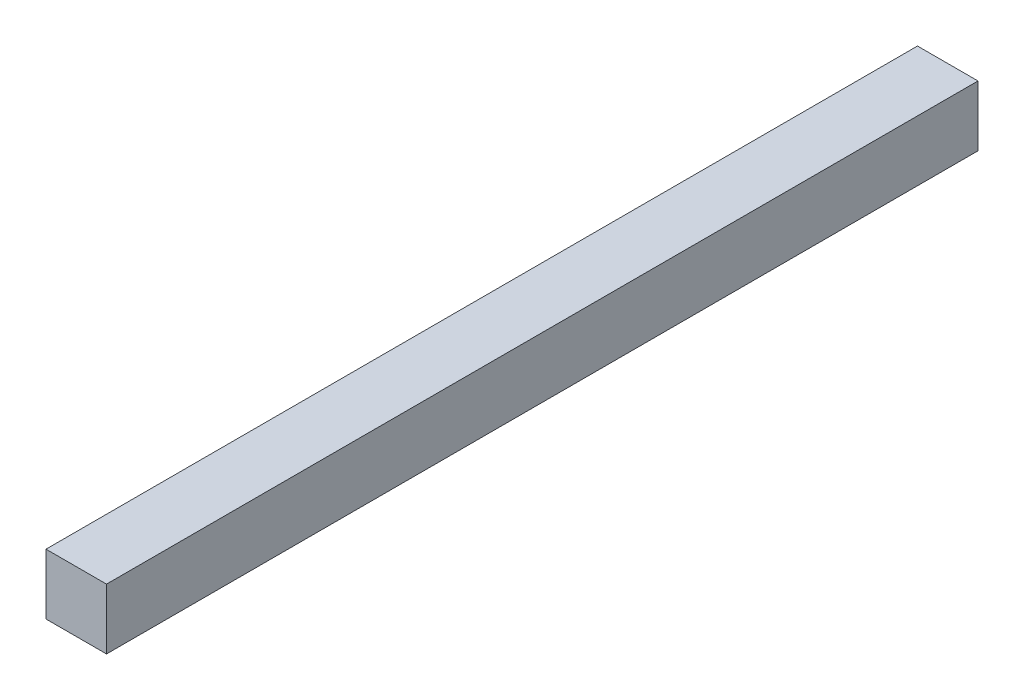
ISO-10303-21;
HEADER;
FILE_DESCRIPTION(('STEP AP214'),'2;1');
FILE_NAME('part.step','',(''),(''),'','','');
FILE_SCHEMA(('AUTOMOTIVE_DESIGN { 1 0 10303 214 1 1 1 1 }'));
ENDSEC;
DATA;
#1=APPLICATION_CONTEXT('core data for automotive mechanical design processes');
#2=APPLICATION_PROTOCOL_DEFINITION('international standard','automotive_design',2000,#1);
#3=PRODUCT_CONTEXT('',#1,'mechanical');
#4=PRODUCT('Part','Part','',(#3));
#5=PRODUCT_RELATED_PRODUCT_CATEGORY('part','',(#4));
#6=PRODUCT_DEFINITION_FORMATION('','',#4);
#7=PRODUCT_DEFINITION_CONTEXT('part definition',#1,'design');
#8=PRODUCT_DEFINITION('design','',#6,#7);
#9=PRODUCT_DEFINITION_SHAPE('','',#8);
#10=(LENGTH_UNIT() NAMED_UNIT(*) SI_UNIT(.MILLI.,.METRE.));
#11=(NAMED_UNIT(*) PLANE_ANGLE_UNIT() SI_UNIT($,.RADIAN.));
#12=(NAMED_UNIT(*) SI_UNIT($,.STERADIAN.) SOLID_ANGLE_UNIT());
#13=UNCERTAINTY_MEASURE_WITH_UNIT(LENGTH_MEASURE(1.E-05),#10,'distance_accuracy_value','');
#14=(GEOMETRIC_REPRESENTATION_CONTEXT(3) GLOBAL_UNCERTAINTY_ASSIGNED_CONTEXT((#13)) GLOBAL_UNIT_ASSIGNED_CONTEXT((#10,
#11,#12)) REPRESENTATION_CONTEXT('',''));
#15=CARTESIAN_POINT('',(0.,0.,0.));
#16=DIRECTION('',(0.,0.,1.));
#17=DIRECTION('',(1.,0.,0.));
#18=AXIS2_PLACEMENT_3D('',#15,#16,#17);
#19=CARTESIAN_POINT('',(25.,-25.,720.));
#20=DIRECTION('',(-1.,0.,0.));
#21=DIRECTION('',(0.,0.,1.));
#22=AXIS2_PLACEMENT_3D('',#19,#20,#21);
#23=PLANE('',#22);
#24=DIRECTION('',(0.,1.,0.));
#25=VECTOR('',#24,1.);
#26=CARTESIAN_POINT('',(25.,-25.,0.));
#27=LINE('',#26,#25);
#28=CARTESIAN_POINT('',(25.,-25.,0.));
#29=VERTEX_POINT('',#28);
#30=CARTESIAN_POINT('',(25.,25.,0.));
#31=VERTEX_POINT('',#30);
#32=EDGE_CURVE('E105',#29,#31,#27,.T.);
#33=ORIENTED_EDGE('',*,*,#32,.T.);
#34=DIRECTION('',(0.,0.,-1.));
#35=VECTOR('',#34,1.);
#36=CARTESIAN_POINT('',(25.,25.,720.));
#37=LINE('',#36,#35);
#38=CARTESIAN_POINT('',(25.,25.,720.));
#39=VERTEX_POINT('',#38);
#40=EDGE_CURVE('E11',#39,#31,#37,.T.);
#41=ORIENTED_EDGE('',*,*,#40,.F.);
#42=DIRECTION('',(0.,1.,0.));
#43=VECTOR('',#42,1.);
#44=CARTESIAN_POINT('',(25.,-25.,720.));
#45=LINE('',#44,#43);
#46=CARTESIAN_POINT('',(25.,-25.,720.));
#47=VERTEX_POINT('',#46);
#48=EDGE_CURVE('E89',#47,#39,#45,.T.);
#49=ORIENTED_EDGE('',*,*,#48,.F.);
#50=DIRECTION('',(0.,0.,-1.));
#51=VECTOR('',#50,1.);
#52=CARTESIAN_POINT('',(25.,-25.,720.));
#53=LINE('',#52,#51);
#54=EDGE_CURVE('E98',#47,#29,#53,.T.);
#55=ORIENTED_EDGE('',*,*,#54,.T.);
#56=EDGE_LOOP('',(#33,#41,#49,#55));
#57=FACE_BOUND('',#56,.T.);
#58=ADVANCED_FACE('F39',(#57),#23,.F.);
#59=CARTESIAN_POINT('',(-25.,25.,720.));
#60=DIRECTION('',(0.,-1.,0.));
#61=DIRECTION('',(0.,0.,-1.));
#62=AXIS2_PLACEMENT_3D('',#59,#60,#61);
#63=PLANE('',#62);
#64=DIRECTION('',(-1.,0.,0.));
#65=VECTOR('',#64,1.);
#66=CARTESIAN_POINT('',(-25.,25.,0.));
#67=LINE('',#66,#65);
#68=CARTESIAN_POINT('',(-25.,25.,0.));
#69=VERTEX_POINT('',#68);
#70=EDGE_CURVE('E94',#31,#69,#67,.T.);
#71=ORIENTED_EDGE('',*,*,#70,.T.);
#72=DIRECTION('',(0.,0.,-1.));
#73=VECTOR('',#72,1.);
#74=CARTESIAN_POINT('',(-25.,25.,720.));
#75=LINE('',#74,#73);
#76=CARTESIAN_POINT('',(-25.,25.,720.));
#77=VERTEX_POINT('',#76);
#78=EDGE_CURVE('E50',#77,#69,#75,.T.);
#79=ORIENTED_EDGE('',*,*,#78,.F.);
#80=DIRECTION('',(-1.,0.,0.));
#81=VECTOR('',#80,1.);
#82=CARTESIAN_POINT('',(-25.,25.,720.));
#83=LINE('',#82,#81);
#84=EDGE_CURVE('E83',#39,#77,#83,.T.);
#85=ORIENTED_EDGE('',*,*,#84,.F.);
#86=ORIENTED_EDGE('',*,*,#40,.T.);
#87=EDGE_LOOP('',(#71,#79,#85,#86));
#88=FACE_BOUND('',#87,.T.);
#89=ADVANCED_FACE('F91',(#88),#63,.F.);
#90=CARTESIAN_POINT('',(-25.,-25.,720.));
#91=DIRECTION('',(1.,0.,0.));
#92=DIRECTION('',(0.,0.,-1.));
#93=AXIS2_PLACEMENT_3D('',#90,#91,#92);
#94=PLANE('',#93);
#95=DIRECTION('',(0.,-1.,0.));
#96=VECTOR('',#95,1.);
#97=CARTESIAN_POINT('',(-25.,-25.,0.));
#98=LINE('',#97,#96);
#99=CARTESIAN_POINT('',(-25.,-25.,0.));
#100=VERTEX_POINT('',#99);
#101=EDGE_CURVE('E75',#69,#100,#98,.T.);
#102=ORIENTED_EDGE('',*,*,#101,.T.);
#103=DIRECTION('',(0.,0.,-1.));
#104=VECTOR('',#103,1.);
#105=CARTESIAN_POINT('',(-25.,-25.,720.));
#106=LINE('',#105,#104);
#107=CARTESIAN_POINT('',(-25.,-25.,720.));
#108=VERTEX_POINT('',#107);
#109=EDGE_CURVE('E92',#108,#100,#106,.T.);
#110=ORIENTED_EDGE('',*,*,#109,.F.);
#111=DIRECTION('',(0.,-1.,0.));
#112=VECTOR('',#111,1.);
#113=CARTESIAN_POINT('',(-25.,-25.,720.));
#114=LINE('',#113,#112);
#115=EDGE_CURVE('E86',#77,#108,#114,.T.);
#116=ORIENTED_EDGE('',*,*,#115,.F.);
#117=ORIENTED_EDGE('',*,*,#78,.T.);
#118=EDGE_LOOP('',(#102,#110,#116,#117));
#119=FACE_BOUND('',#118,.T.);
#120=ADVANCED_FACE('F96',(#119),#94,.F.);
#121=CARTESIAN_POINT('',(-25.,-25.,720.));
#122=DIRECTION('',(0.,1.,0.));
#123=DIRECTION('',(0.,0.,1.));
#124=AXIS2_PLACEMENT_3D('',#121,#122,#123);
#125=PLANE('',#124);
#126=DIRECTION('',(1.,0.,0.));
#127=VECTOR('',#126,1.);
#128=CARTESIAN_POINT('',(-25.,-25.,0.));
#129=LINE('',#128,#127);
#130=EDGE_CURVE('E77',#100,#29,#129,.T.);
#131=ORIENTED_EDGE('',*,*,#130,.T.);
#132=ORIENTED_EDGE('',*,*,#54,.F.);
#133=DIRECTION('',(1.,0.,0.));
#134=VECTOR('',#133,1.);
#135=CARTESIAN_POINT('',(-25.,-25.,720.));
#136=LINE('',#135,#134);
#137=EDGE_CURVE('E54',#108,#47,#136,.T.);
#138=ORIENTED_EDGE('',*,*,#137,.F.);
#139=ORIENTED_EDGE('',*,*,#109,.T.);
#140=EDGE_LOOP('',(#131,#132,#138,#139));
#141=FACE_BOUND('',#140,.T.);
#142=ADVANCED_FACE('F108',(#141),#125,.F.);
#143=CARTESIAN_POINT('',(0.,0.,720.));
#144=DIRECTION('',(0.,0.,-1.));
#145=DIRECTION('',(-1.,0.,0.));
#146=AXIS2_PLACEMENT_3D('',#143,#144,#145);
#147=PLANE('',#146);
#148=ORIENTED_EDGE('',*,*,#48,.T.);
#149=ORIENTED_EDGE('',*,*,#84,.T.);
#150=ORIENTED_EDGE('',*,*,#115,.T.);
#151=ORIENTED_EDGE('',*,*,#137,.T.);
#152=EDGE_LOOP('',(#148,#149,#150,#151));
#153=FACE_BOUND('',#152,.T.);
#154=ADVANCED_FACE('F88',(#153),#147,.F.);
#155=CARTESIAN_POINT('',(0.,0.,0.));
#156=DIRECTION('',(0.,0.,-1.));
#157=DIRECTION('',(-1.,0.,0.));
#158=AXIS2_PLACEMENT_3D('',#155,#156,#157);
#159=PLANE('',#158);
#160=ORIENTED_EDGE('',*,*,#32,.F.);
#161=ORIENTED_EDGE('',*,*,#130,.F.);
#162=ORIENTED_EDGE('',*,*,#101,.F.);
#163=ORIENTED_EDGE('',*,*,#70,.F.);
#164=EDGE_LOOP('',(#160,#161,#162,#163));
#165=FACE_BOUND('',#164,.T.);
#166=ADVANCED_FACE('F115',(#165),#159,.T.);
#167=CLOSED_SHELL('',(#58,#89,#120,#142,#154,#166));
#168=MANIFOLD_SOLID_BREP('B2',#167);
#169=ADVANCED_BREP_SHAPE_REPRESENTATION('',(#18,#168),#14);
#170=SHAPE_DEFINITION_REPRESENTATION(#9,#169);
ENDSEC;
END-ISO-10303-21;
